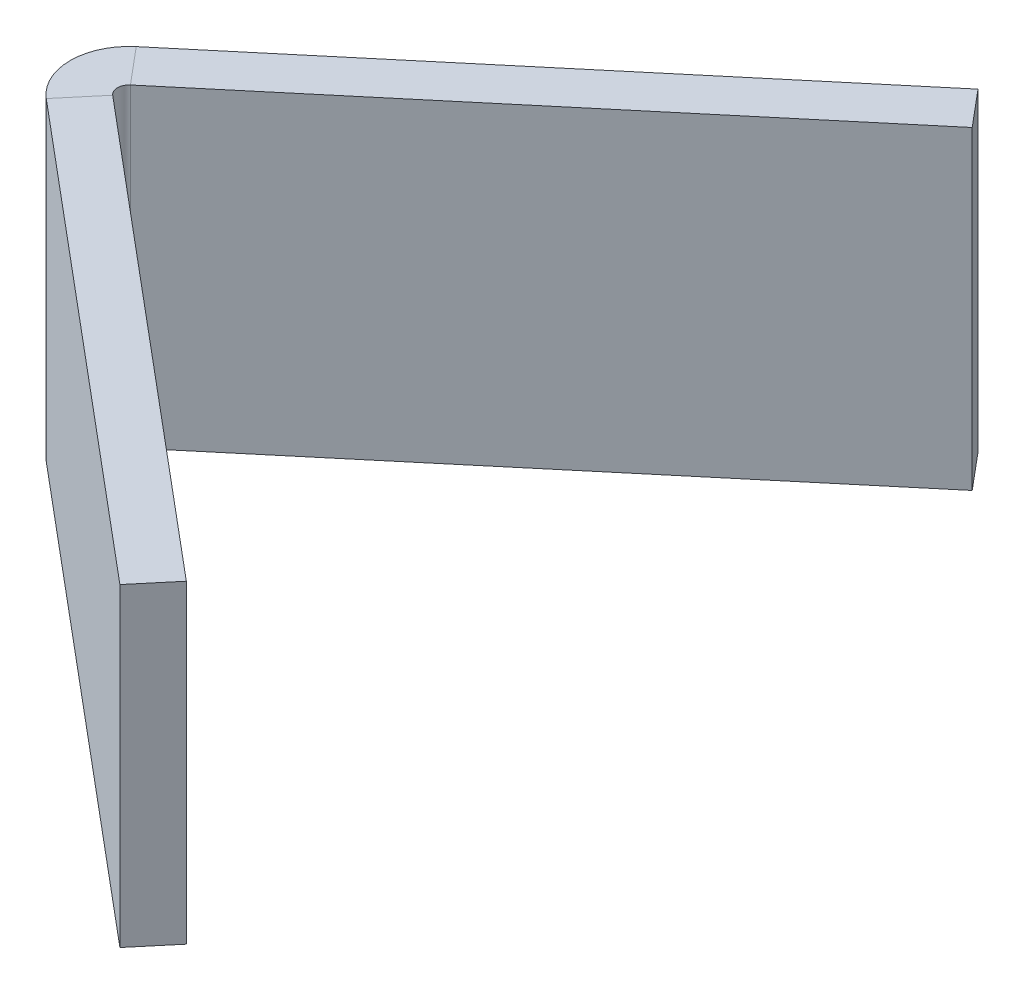
ISO-10303-21;
HEADER;
FILE_DESCRIPTION(('STEP AP214'),'2;1');
FILE_NAME('part.step','',(''),(''),'','','');
FILE_SCHEMA(('AUTOMOTIVE_DESIGN { 1 0 10303 214 1 1 1 1 }'));
ENDSEC;
DATA;
#1=APPLICATION_CONTEXT('core data for automotive mechanical design processes');
#2=APPLICATION_PROTOCOL_DEFINITION('international standard','automotive_design',2000,#1);
#3=PRODUCT_CONTEXT('',#1,'mechanical');
#4=PRODUCT('Part','Part','',(#3));
#5=PRODUCT_RELATED_PRODUCT_CATEGORY('part','',(#4));
#6=PRODUCT_DEFINITION_FORMATION('','',#4);
#7=PRODUCT_DEFINITION_CONTEXT('part definition',#1,'design');
#8=PRODUCT_DEFINITION('design','',#6,#7);
#9=PRODUCT_DEFINITION_SHAPE('','',#8);
#10=(LENGTH_UNIT() NAMED_UNIT(*) SI_UNIT(.MILLI.,.METRE.));
#11=(NAMED_UNIT(*) PLANE_ANGLE_UNIT() SI_UNIT($,.RADIAN.));
#12=(NAMED_UNIT(*) SI_UNIT($,.STERADIAN.) SOLID_ANGLE_UNIT());
#13=UNCERTAINTY_MEASURE_WITH_UNIT(LENGTH_MEASURE(1.E-05),#10,'distance_accuracy_value','');
#14=(GEOMETRIC_REPRESENTATION_CONTEXT(3) GLOBAL_UNCERTAINTY_ASSIGNED_CONTEXT((#13)) GLOBAL_UNIT_ASSIGNED_CONTEXT((#10,
#11,#12)) REPRESENTATION_CONTEXT('',''));
#15=CARTESIAN_POINT('',(0.,0.,0.));
#16=DIRECTION('',(0.,0.,1.));
#17=DIRECTION('',(1.,0.,0.));
#18=AXIS2_PLACEMENT_3D('',#15,#16,#17);
#19=CARTESIAN_POINT('',(0.672468817570268,20.,0.564268336801444));
#20=DIRECTION('',(0.,1.,0.));
#21=DIRECTION('',(0.,0.,1.));
#22=AXIS2_PLACEMENT_3D('',#19,#20,#21);
#23=PLANE('',#22);
#24=DIRECTION('',(-0.642787609686546,0.,0.766044443118972));
#25=VECTOR('',#24,1.);
#26=CARTESIAN_POINT('',(0.672468817570268,20.,0.564268336801444));
#27=LINE('',#26,#25);
#28=CARTESIAN_POINT('',(0.672468817570268,20.,0.564268336801444));
#29=VERTEX_POINT('',#28);
#30=CARTESIAN_POINT('',(-1.25589401148937,20.,2.86240166615836));
#31=VERTEX_POINT('',#30);
#32=EDGE_CURVE('E11',#29,#31,#27,.T.);
#33=ORIENTED_EDGE('',*,*,#32,.F.);
#34=CARTESIAN_POINT('',(1.14594617086538,20.,0.));
#35=DIRECTION('',(0.,-1.,0.));
#36=DIRECTION('',(0.,0.,-1.));
#37=AXIS2_PLACEMENT_3D('',#34,#35,#36);
#38=CIRCLE('',#37,0.7366);
#39=CARTESIAN_POINT('',(0.672468817570277,20.,-0.564268336801434));
#40=VERTEX_POINT('',#39);
#41=EDGE_CURVE('E141',#40,#29,#38,.F.);
#42=ORIENTED_EDGE('',*,*,#41,.F.);
#43=DIRECTION('',(0.642787609686535,0.,0.766044443118982));
#44=VECTOR('',#43,1.);
#45=CARTESIAN_POINT('',(-1.25589401148933,20.,-2.86240166615838));
#46=LINE('',#45,#44);
#47=CARTESIAN_POINT('',(-1.25589401148933,20.,-2.86240166615838));
#48=VERTEX_POINT('',#47);
#49=EDGE_CURVE('E48',#48,#40,#46,.T.);
#50=ORIENTED_EDGE('',*,*,#49,.F.);
#51=CARTESIAN_POINT('',(1.14594617086538,20.,0.));
#52=DIRECTION('',(0.,1.,0.));
#53=DIRECTION('',(1.,0.,0.));
#54=AXIS2_PLACEMENT_3D('',#51,#52,#53);
#55=CIRCLE('',#54,3.7366);
#56=EDGE_CURVE('E132',#48,#31,#55,.T.);
#57=ORIENTED_EDGE('',*,*,#56,.T.);
#58=EDGE_LOOP('',(#33,#42,#50,#57));
#59=FACE_BOUND('',#58,.T.);
#60=ADVANCED_FACE('F39',(#59),#23,.T.);
#61=CARTESIAN_POINT('',(-1.25589401148933,20.,-2.86240166615838));
#62=DIRECTION('',(0.,1.,0.));
#63=DIRECTION('',(0.,0.,1.));
#64=AXIS2_PLACEMENT_3D('',#61,#62,#63);
#65=PLANE('',#64);
#66=DIRECTION('',(0.766044443118972,0.,0.642787609686546));
#67=VECTOR('',#66,1.);
#68=CARTESIAN_POINT('',(0.,20.,0.));
#69=LINE('',#68,#67);
#70=CARTESIAN_POINT('',(29.7938398148552,20.,25.0000000000004));
#71=VERTEX_POINT('',#70);
#72=EDGE_CURVE('E210',#29,#71,#69,.T.);
#73=ORIENTED_EDGE('',*,*,#72,.F.);
#74=ORIENTED_EDGE('',*,*,#32,.T.);
#75=DIRECTION('',(0.766044443118972,0.,0.642787609686546));
#76=VECTOR('',#75,1.);
#77=CARTESIAN_POINT('',(-1.92836282905964,20.,2.29813332935692));
#78=LINE('',#77,#76);
#79=CARTESIAN_POINT('',(27.8654769857955,20.,27.2981333293573));
#80=VERTEX_POINT('',#79);
#81=EDGE_CURVE('E96',#31,#80,#78,.T.);
#82=ORIENTED_EDGE('',*,*,#81,.T.);
#83=DIRECTION('',(-0.642787609686546,0.,0.766044443118973));
#84=VECTOR('',#83,1.);
#85=CARTESIAN_POINT('',(29.7938398148552,20.,25.0000000000004));
#86=LINE('',#85,#84);
#87=EDGE_CURVE('E368',#71,#80,#86,.T.);
#88=ORIENTED_EDGE('',*,*,#87,.F.);
#89=EDGE_LOOP('',(#73,#74,#82,#88));
#90=FACE_BOUND('',#89,.T.);
#91=ADVANCED_FACE('F218',(#90),#65,.T.);
#92=CARTESIAN_POINT('',(0.672468817570277,0.,-0.564268336801434));
#93=DIRECTION('',(0.,-1.,0.));
#94=DIRECTION('',(0.,0.,-1.));
#95=AXIS2_PLACEMENT_3D('',#92,#93,#94);
#96=PLANE('',#95);
#97=DIRECTION('',(-0.642787609686535,0.,-0.766044443118982));
#98=VECTOR('',#97,1.);
#99=CARTESIAN_POINT('',(0.672468817570277,0.,-0.564268336801434));
#100=LINE('',#99,#98);
#101=CARTESIAN_POINT('',(0.672468817570277,0.,-0.564268336801434));
#102=VERTEX_POINT('',#101);
#103=CARTESIAN_POINT('',(-1.25589401148933,0.,-2.86240166615838));
#104=VERTEX_POINT('',#103);
#105=EDGE_CURVE('E83',#102,#104,#100,.T.);
#106=ORIENTED_EDGE('',*,*,#105,.F.);
#107=CARTESIAN_POINT('',(1.14594617086538,0.,0.));
#108=DIRECTION('',(0.,-1.,0.));
#109=DIRECTION('',(0.,0.,-1.));
#110=AXIS2_PLACEMENT_3D('',#107,#108,#109);
#111=CIRCLE('',#110,0.7366);
#112=CARTESIAN_POINT('',(0.672468817570268,0.,0.564268336801444));
#113=VERTEX_POINT('',#112);
#114=EDGE_CURVE('E160',#102,#113,#111,.F.);
#115=ORIENTED_EDGE('',*,*,#114,.T.);
#116=DIRECTION('',(0.642787609686546,0.,-0.766044443118972));
#117=VECTOR('',#116,1.);
#118=CARTESIAN_POINT('',(-1.25589401148937,0.,2.86240166615836));
#119=LINE('',#118,#117);
#120=CARTESIAN_POINT('',(-1.25589401148937,0.,2.86240166615836));
#121=VERTEX_POINT('',#120);
#122=EDGE_CURVE('E90',#121,#113,#119,.T.);
#123=ORIENTED_EDGE('',*,*,#122,.F.);
#124=CARTESIAN_POINT('',(1.14594617086538,0.,0.));
#125=DIRECTION('',(0.,1.,0.));
#126=DIRECTION('',(1.,0.,0.));
#127=AXIS2_PLACEMENT_3D('',#124,#125,#126);
#128=CIRCLE('',#127,3.7366);
#129=EDGE_CURVE('E171',#104,#121,#128,.T.);
#130=ORIENTED_EDGE('',*,*,#129,.F.);
#131=EDGE_LOOP('',(#106,#115,#123,#130));
#132=FACE_BOUND('',#131,.T.);
#133=ADVANCED_FACE('F216',(#132),#96,.T.);
#134=CARTESIAN_POINT('',(-1.25589401148937,0.,2.86240166615836));
#135=DIRECTION('',(0.,-1.,0.));
#136=DIRECTION('',(0.,0.,-1.));
#137=AXIS2_PLACEMENT_3D('',#134,#135,#136);
#138=PLANE('',#137);
#139=DIRECTION('',(-0.766044443118982,0.,0.642787609686535));
#140=VECTOR('',#139,1.);
#141=CARTESIAN_POINT('',(0.,0.,0.));
#142=LINE('',#141,#140);
#143=CARTESIAN_POINT('',(29.7938398148552,0.,-24.9999999999996));
#144=VERTEX_POINT('',#143);
#145=EDGE_CURVE('E163',#144,#102,#142,.T.);
#146=ORIENTED_EDGE('',*,*,#145,.T.);
#147=ORIENTED_EDGE('',*,*,#105,.T.);
#148=DIRECTION('',(-0.766044443118982,0.,0.642787609686535));
#149=VECTOR('',#148,1.);
#150=CARTESIAN_POINT('',(-1.9283628290596,0.,-2.29813332935695));
#151=LINE('',#150,#149);
#152=CARTESIAN_POINT('',(27.8654769857956,0.,-27.2981333293566));
#153=VERTEX_POINT('',#152);
#154=EDGE_CURVE('E168',#153,#104,#151,.T.);
#155=ORIENTED_EDGE('',*,*,#154,.F.);
#156=DIRECTION('',(0.642787609686532,0.,0.766044443118984));
#157=VECTOR('',#156,1.);
#158=CARTESIAN_POINT('',(27.8654769857956,0.,-27.2981333293566));
#159=LINE('',#158,#157);
#160=EDGE_CURVE('E118',#153,#144,#159,.T.);
#161=ORIENTED_EDGE('',*,*,#160,.T.);
#162=EDGE_LOOP('',(#146,#147,#155,#161));
#163=FACE_BOUND('',#162,.T.);
#164=ADVANCED_FACE('F212',(#163),#138,.T.);
#165=CARTESIAN_POINT('',(-1.92836282905964,20.,2.29813332935692));
#166=DIRECTION('',(0.642787609686546,0.,-0.766044443118972));
#167=DIRECTION('',(-0.766044443118972,0.,-0.642787609686546));
#168=AXIS2_PLACEMENT_3D('',#165,#166,#167);
#169=PLANE('',#168);
#170=DIRECTION('',(0.766044443118972,0.,0.642787609686546));
#171=VECTOR('',#170,1.);
#172=CARTESIAN_POINT('',(-1.92836282905964,0.,2.29813332935692));
#173=LINE('',#172,#171);
#174=CARTESIAN_POINT('',(27.8654769857955,0.,27.2981333293573));
#175=VERTEX_POINT('',#174);
#176=EDGE_CURVE('E148',#121,#175,#173,.T.);
#177=ORIENTED_EDGE('',*,*,#176,.T.);
#178=DIRECTION('',(0.,-1.,0.));
#179=VECTOR('',#178,1.);
#180=CARTESIAN_POINT('',(27.8654769857955,20.,27.2981333293573));
#181=LINE('',#180,#179);
#182=EDGE_CURVE('E192',#80,#175,#181,.T.);
#183=ORIENTED_EDGE('',*,*,#182,.F.);
#184=ORIENTED_EDGE('',*,*,#81,.F.);
#185=DIRECTION('',(0.,-1.,0.));
#186=VECTOR('',#185,1.);
#187=CARTESIAN_POINT('',(-1.25589401148937,20.,2.86240166615836));
#188=LINE('',#187,#186);
#189=EDGE_CURVE('E147',#31,#121,#188,.T.);
#190=ORIENTED_EDGE('',*,*,#189,.T.);
#191=EDGE_LOOP('',(#177,#183,#184,#190));
#192=FACE_BOUND('',#191,.T.);
#193=ADVANCED_FACE('F224',(#192),#169,.F.);
#194=CARTESIAN_POINT('',(29.7938398148552,20.,25.0000000000004));
#195=DIRECTION('',(0.766044443118973,0.,0.642787609686546));
#196=DIRECTION('',(0.642787609686546,0.,-0.766044443118973));
#197=AXIS2_PLACEMENT_3D('',#194,#195,#196);
#198=PLANE('',#197);
#199=DIRECTION('',(-0.642787609686546,0.,0.766044443118973));
#200=VECTOR('',#199,1.);
#201=CARTESIAN_POINT('',(29.7938398148552,0.,25.0000000000004));
#202=LINE('',#201,#200);
#203=CARTESIAN_POINT('',(29.7938398148552,0.,25.0000000000004));
#204=VERTEX_POINT('',#203);
#205=EDGE_CURVE('E152',#204,#175,#202,.T.);
#206=ORIENTED_EDGE('',*,*,#205,.F.);
#207=DIRECTION('',(0.,-1.,0.));
#208=VECTOR('',#207,1.);
#209=CARTESIAN_POINT('',(29.7938398148552,20.,25.0000000000004));
#210=LINE('',#209,#208);
#211=EDGE_CURVE('E189',#71,#204,#210,.T.);
#212=ORIENTED_EDGE('',*,*,#211,.F.);
#213=ORIENTED_EDGE('',*,*,#87,.T.);
#214=ORIENTED_EDGE('',*,*,#182,.T.);
#215=EDGE_LOOP('',(#206,#212,#213,#214));
#216=FACE_BOUND('',#215,.T.);
#217=ADVANCED_FACE('F255',(#216),#198,.T.);
#218=CARTESIAN_POINT('',(0.,20.,0.));
#219=DIRECTION('',(0.642787609686546,0.,-0.766044443118972));
#220=DIRECTION('',(-0.766044443118972,0.,-0.642787609686546));
#221=AXIS2_PLACEMENT_3D('',#218,#219,#220);
#222=PLANE('',#221);
#223=DIRECTION('',(0.766044443118972,0.,0.642787609686546));
#224=VECTOR('',#223,1.);
#225=CARTESIAN_POINT('',(0.,0.,0.));
#226=LINE('',#225,#224);
#227=EDGE_CURVE('E156',#113,#204,#226,.T.);
#228=ORIENTED_EDGE('',*,*,#227,.F.);
#229=DIRECTION('',(0.,-1.,0.));
#230=VECTOR('',#229,1.);
#231=CARTESIAN_POINT('',(0.672468817570268,20.,0.564268336801444));
#232=LINE('',#231,#230);
#233=EDGE_CURVE('E185',#29,#113,#232,.T.);
#234=ORIENTED_EDGE('',*,*,#233,.F.);
#235=ORIENTED_EDGE('',*,*,#72,.T.);
#236=ORIENTED_EDGE('',*,*,#211,.T.);
#237=EDGE_LOOP('',(#228,#234,#235,#236));
#238=FACE_BOUND('',#237,.T.);
#239=ADVANCED_FACE('F266',(#238),#222,.T.);
#240=CARTESIAN_POINT('',(1.14594617086538,20.,0.));
#241=DIRECTION('',(0.,-1.,0.));
#242=DIRECTION('',(0.,0.,-1.));
#243=AXIS2_PLACEMENT_3D('',#240,#241,#242);
#244=CYLINDRICAL_SURFACE('',#243,0.7366);
#245=ORIENTED_EDGE('',*,*,#114,.F.);
#246=DIRECTION('',(0.,-1.,0.));
#247=VECTOR('',#246,1.);
#248=CARTESIAN_POINT('',(0.672468817570277,20.,-0.564268336801434));
#249=LINE('',#248,#247);
#250=EDGE_CURVE('E181',#40,#102,#249,.T.);
#251=ORIENTED_EDGE('',*,*,#250,.F.);
#252=ORIENTED_EDGE('',*,*,#41,.T.);
#253=ORIENTED_EDGE('',*,*,#233,.T.);
#254=EDGE_LOOP('',(#245,#251,#252,#253));
#255=FACE_BOUND('',#254,.T.);
#256=ADVANCED_FACE('F205',(#255),#244,.F.);
#257=CARTESIAN_POINT('',(0.,20.,0.));
#258=DIRECTION('',(0.642787609686535,0.,0.766044443118982));
#259=DIRECTION('',(0.766044443118982,0.,-0.642787609686535));
#260=AXIS2_PLACEMENT_3D('',#257,#258,#259);
#261=PLANE('',#260);
#262=ORIENTED_EDGE('',*,*,#145,.F.);
#263=DIRECTION('',(0.,-1.,0.));
#264=VECTOR('',#263,1.);
#265=CARTESIAN_POINT('',(29.7938398148552,20.,-24.9999999999996));
#266=LINE('',#265,#264);
#267=CARTESIAN_POINT('',(29.7938398148552,20.,-24.9999999999996));
#268=VERTEX_POINT('',#267);
#269=EDGE_CURVE('E121',#268,#144,#266,.T.);
#270=ORIENTED_EDGE('',*,*,#269,.F.);
#271=DIRECTION('',(-0.766044443118982,0.,0.642787609686535));
#272=VECTOR('',#271,1.);
#273=CARTESIAN_POINT('',(0.,20.,0.));
#274=LINE('',#273,#272);
#275=EDGE_CURVE('E137',#268,#40,#274,.T.);
#276=ORIENTED_EDGE('',*,*,#275,.T.);
#277=ORIENTED_EDGE('',*,*,#250,.T.);
#278=EDGE_LOOP('',(#262,#270,#276,#277));
#279=FACE_BOUND('',#278,.T.);
#280=ADVANCED_FACE('F211',(#279),#261,.T.);
#281=CARTESIAN_POINT('',(27.8654769857956,20.,-27.2981333293566));
#282=DIRECTION('',(0.766044443118984,0.,-0.642787609686532));
#283=DIRECTION('',(-0.642787609686532,0.,-0.766044443118984));
#284=AXIS2_PLACEMENT_3D('',#281,#282,#283);
#285=PLANE('',#284);
#286=ORIENTED_EDGE('',*,*,#160,.F.);
#287=DIRECTION('',(0.,-1.,0.));
#288=VECTOR('',#287,1.);
#289=CARTESIAN_POINT('',(27.8654769857956,20.,-27.2981333293566));
#290=LINE('',#289,#288);
#291=CARTESIAN_POINT('',(27.8654769857956,20.,-27.2981333293566));
#292=VERTEX_POINT('',#291);
#293=EDGE_CURVE('E112',#292,#153,#290,.T.);
#294=ORIENTED_EDGE('',*,*,#293,.F.);
#295=DIRECTION('',(0.642787609686532,0.,0.766044443118984));
#296=VECTOR('',#295,1.);
#297=CARTESIAN_POINT('',(27.8654769857956,20.,-27.2981333293566));
#298=LINE('',#297,#296);
#299=EDGE_CURVE('E116',#292,#268,#298,.T.);
#300=ORIENTED_EDGE('',*,*,#299,.T.);
#301=ORIENTED_EDGE('',*,*,#269,.T.);
#302=EDGE_LOOP('',(#286,#294,#300,#301));
#303=FACE_BOUND('',#302,.T.);
#304=ADVANCED_FACE('F114',(#303),#285,.T.);
#305=CARTESIAN_POINT('',(-1.9283628290596,20.,-2.29813332935695));
#306=DIRECTION('',(0.642787609686535,0.,0.766044443118982));
#307=DIRECTION('',(0.766044443118982,0.,-0.642787609686535));
#308=AXIS2_PLACEMENT_3D('',#305,#306,#307);
#309=PLANE('',#308);
#310=ORIENTED_EDGE('',*,*,#154,.T.);
#311=DIRECTION('',(0.,-1.,0.));
#312=VECTOR('',#311,1.);
#313=CARTESIAN_POINT('',(-1.25589401148933,20.,-2.86240166615838));
#314=LINE('',#313,#312);
#315=EDGE_CURVE('E122',#48,#104,#314,.T.);
#316=ORIENTED_EDGE('',*,*,#315,.F.);
#317=DIRECTION('',(-0.766044443118982,0.,0.642787609686535));
#318=VECTOR('',#317,1.);
#319=CARTESIAN_POINT('',(-1.9283628290596,20.,-2.29813332935695));
#320=LINE('',#319,#318);
#321=EDGE_CURVE('E126',#292,#48,#320,.T.);
#322=ORIENTED_EDGE('',*,*,#321,.F.);
#323=ORIENTED_EDGE('',*,*,#293,.T.);
#324=EDGE_LOOP('',(#310,#316,#322,#323));
#325=FACE_BOUND('',#324,.T.);
#326=ADVANCED_FACE('F127',(#325),#309,.F.);
#327=CARTESIAN_POINT('',(1.14594617086538,20.,0.));
#328=DIRECTION('',(0.,-1.,0.));
#329=DIRECTION('',(0.,0.,-1.));
#330=AXIS2_PLACEMENT_3D('',#327,#328,#329);
#331=CYLINDRICAL_SURFACE('',#330,3.7366);
#332=ORIENTED_EDGE('',*,*,#129,.T.);
#333=ORIENTED_EDGE('',*,*,#189,.F.);
#334=ORIENTED_EDGE('',*,*,#56,.F.);
#335=ORIENTED_EDGE('',*,*,#315,.T.);
#336=EDGE_LOOP('',(#332,#333,#334,#335));
#337=FACE_BOUND('',#336,.T.);
#338=ADVANCED_FACE('F214',(#337),#331,.T.);
#339=CARTESIAN_POINT('',(1.14594617086538,20.,0.));
#340=DIRECTION('',(0.,-1.,0.));
#341=DIRECTION('',(-1.,0.,0.));
#342=AXIS2_PLACEMENT_3D('',#339,#340,#341);
#343=PLANE('',#342);
#344=ORIENTED_EDGE('',*,*,#321,.T.);
#345=ORIENTED_EDGE('',*,*,#49,.T.);
#346=ORIENTED_EDGE('',*,*,#275,.F.);
#347=ORIENTED_EDGE('',*,*,#299,.F.);
#348=EDGE_LOOP('',(#344,#345,#346,#347));
#349=FACE_BOUND('',#348,.T.);
#350=ADVANCED_FACE('F135',(#349),#343,.F.);
#351=CARTESIAN_POINT('',(1.14594617086538,0.,0.));
#352=DIRECTION('',(0.,-1.,0.));
#353=DIRECTION('',(-1.,0.,0.));
#354=AXIS2_PLACEMENT_3D('',#351,#352,#353);
#355=PLANE('',#354);
#356=ORIENTED_EDGE('',*,*,#176,.F.);
#357=ORIENTED_EDGE('',*,*,#122,.T.);
#358=ORIENTED_EDGE('',*,*,#227,.T.);
#359=ORIENTED_EDGE('',*,*,#205,.T.);
#360=EDGE_LOOP('',(#356,#357,#358,#359));
#361=FACE_BOUND('',#360,.T.);
#362=ADVANCED_FACE('F332',(#361),#355,.T.);
#363=CLOSED_SHELL('',(#60,#91,#133,#164,#193,#217,#239,#256,#280,#304,#326,#338,#350,#362));
#364=MANIFOLD_SOLID_BREP('B2',#363);
#365=ADVANCED_BREP_SHAPE_REPRESENTATION('',(#18,#364),#14);
#366=SHAPE_DEFINITION_REPRESENTATION(#9,#365);
ENDSEC;
END-ISO-10303-21;
